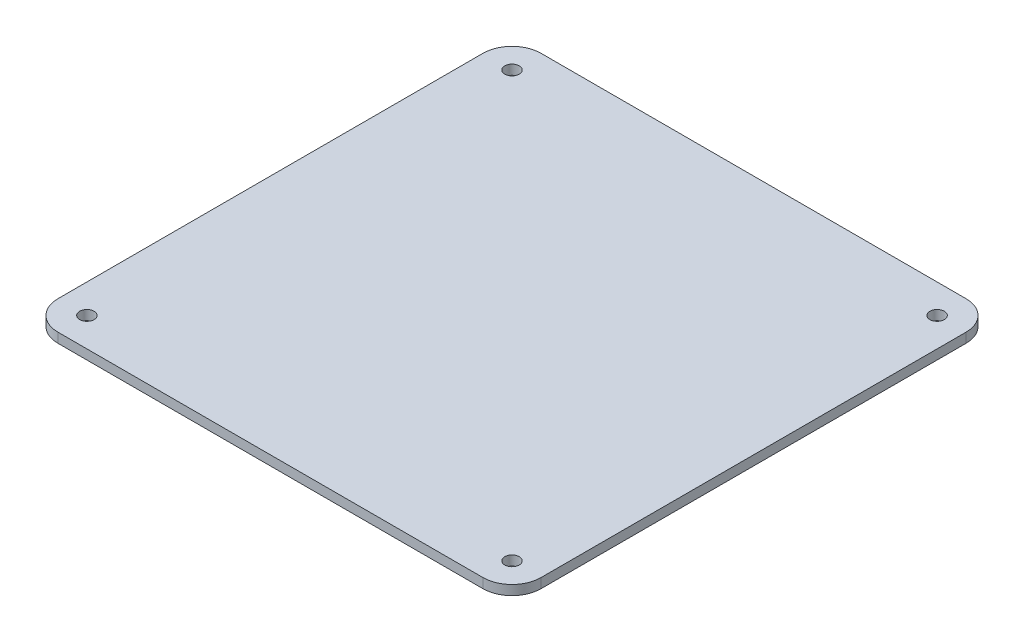
ISO-10303-21;
HEADER;
FILE_DESCRIPTION(('STEP AP214'),'2;1');
FILE_NAME('part.step','',(''),(''),'','','');
FILE_SCHEMA(('AUTOMOTIVE_DESIGN { 1 0 10303 214 1 1 1 1 }'));
ENDSEC;
DATA;
#1=APPLICATION_CONTEXT('core data for automotive mechanical design processes');
#2=APPLICATION_PROTOCOL_DEFINITION('international standard','automotive_design',2000,#1);
#3=PRODUCT_CONTEXT('',#1,'mechanical');
#4=PRODUCT('Part','Part','',(#3));
#5=PRODUCT_RELATED_PRODUCT_CATEGORY('part','',(#4));
#6=PRODUCT_DEFINITION_FORMATION('','',#4);
#7=PRODUCT_DEFINITION_CONTEXT('part definition',#1,'design');
#8=PRODUCT_DEFINITION('design','',#6,#7);
#9=PRODUCT_DEFINITION_SHAPE('','',#8);
#10=(LENGTH_UNIT() NAMED_UNIT(*) SI_UNIT(.MILLI.,.METRE.));
#11=(NAMED_UNIT(*) PLANE_ANGLE_UNIT() SI_UNIT($,.RADIAN.));
#12=(NAMED_UNIT(*) SI_UNIT($,.STERADIAN.) SOLID_ANGLE_UNIT());
#13=UNCERTAINTY_MEASURE_WITH_UNIT(LENGTH_MEASURE(1.E-05),#10,'distance_accuracy_value','');
#14=(GEOMETRIC_REPRESENTATION_CONTEXT(3) GLOBAL_UNCERTAINTY_ASSIGNED_CONTEXT((#13)) GLOBAL_UNIT_ASSIGNED_CONTEXT((#10,
#11,#12)) REPRESENTATION_CONTEXT('',''));
#15=CARTESIAN_POINT('',(0.,0.,0.));
#16=DIRECTION('',(0.,0.,1.));
#17=DIRECTION('',(1.,0.,0.));
#18=AXIS2_PLACEMENT_3D('',#15,#16,#17);
#19=CARTESIAN_POINT('',(-50.,2.,-50.));
#20=DIRECTION('',(1.,0.,0.));
#21=DIRECTION('',(0.,0.,-1.));
#22=AXIS2_PLACEMENT_3D('',#19,#20,#21);
#23=PLANE('',#22);
#24=DIRECTION('',(0.,0.,1.));
#25=VECTOR('',#24,1.);
#26=CARTESIAN_POINT('',(-50.,0.,-50.));
#27=LINE('',#26,#25);
#28=CARTESIAN_POINT('',(-50.,0.,-44.));
#29=VERTEX_POINT('',#28);
#30=CARTESIAN_POINT('',(-50.,0.,44.));
#31=VERTEX_POINT('',#30);
#32=EDGE_CURVE('E139',#29,#31,#27,.T.);
#33=ORIENTED_EDGE('',*,*,#32,.T.);
#34=DIRECTION('',(0.,-1.,0.));
#35=VECTOR('',#34,1.);
#36=CARTESIAN_POINT('',(-50.,2.,44.));
#37=LINE('',#36,#35);
#38=CARTESIAN_POINT('',(-50.,2.,44.));
#39=VERTEX_POINT('',#38);
#40=EDGE_CURVE('E117',#31,#39,#37,.F.);
#41=ORIENTED_EDGE('',*,*,#40,.T.);
#42=DIRECTION('',(0.,0.,1.));
#43=VECTOR('',#42,1.);
#44=CARTESIAN_POINT('',(-50.,2.,-50.));
#45=LINE('',#44,#43);
#46=CARTESIAN_POINT('',(-50.,2.,-44.));
#47=VERTEX_POINT('',#46);
#48=EDGE_CURVE('E151',#47,#39,#45,.T.);
#49=ORIENTED_EDGE('',*,*,#48,.F.);
#50=DIRECTION('',(0.,-1.,0.));
#51=VECTOR('',#50,1.);
#52=CARTESIAN_POINT('',(-50.,2.,-44.));
#53=LINE('',#52,#51);
#54=EDGE_CURVE('E122',#47,#29,#53,.T.);
#55=ORIENTED_EDGE('',*,*,#54,.T.);
#56=EDGE_LOOP('',(#33,#41,#49,#55));
#57=FACE_BOUND('',#56,.T.);
#58=ADVANCED_FACE('F42',(#57),#23,.F.);
#59=CARTESIAN_POINT('',(50.,2.,50.));
#60=DIRECTION('',(0.,0.,-1.));
#61=DIRECTION('',(-1.,0.,0.));
#62=AXIS2_PLACEMENT_3D('',#59,#60,#61);
#63=PLANE('',#62);
#64=DIRECTION('',(1.,0.,0.));
#65=VECTOR('',#64,1.);
#66=CARTESIAN_POINT('',(50.,2.,50.));
#67=LINE('',#66,#65);
#68=CARTESIAN_POINT('',(-44.,2.,50.));
#69=VERTEX_POINT('',#68);
#70=CARTESIAN_POINT('',(44.,2.,50.));
#71=VERTEX_POINT('',#70);
#72=EDGE_CURVE('E132',#69,#71,#67,.T.);
#73=ORIENTED_EDGE('',*,*,#72,.F.);
#74=DIRECTION('',(0.,-1.,0.));
#75=VECTOR('',#74,1.);
#76=CARTESIAN_POINT('',(-44.,2.,50.));
#77=LINE('',#76,#75);
#78=CARTESIAN_POINT('',(-44.,0.,50.));
#79=VERTEX_POINT('',#78);
#80=EDGE_CURVE('E116',#69,#79,#77,.T.);
#81=ORIENTED_EDGE('',*,*,#80,.T.);
#82=DIRECTION('',(1.,0.,0.));
#83=VECTOR('',#82,1.);
#84=CARTESIAN_POINT('',(50.,0.,50.));
#85=LINE('',#84,#83);
#86=CARTESIAN_POINT('',(44.,0.,50.));
#87=VERTEX_POINT('',#86);
#88=EDGE_CURVE('E129',#79,#87,#85,.T.);
#89=ORIENTED_EDGE('',*,*,#88,.T.);
#90=DIRECTION('',(0.,-1.,0.));
#91=VECTOR('',#90,1.);
#92=CARTESIAN_POINT('',(44.,2.,50.));
#93=LINE('',#92,#91);
#94=EDGE_CURVE('E134',#87,#71,#93,.F.);
#95=ORIENTED_EDGE('',*,*,#94,.T.);
#96=EDGE_LOOP('',(#73,#81,#89,#95));
#97=FACE_BOUND('',#96,.T.);
#98=ADVANCED_FACE('F128',(#97),#63,.F.);
#99=CARTESIAN_POINT('',(50.,2.,-50.));
#100=DIRECTION('',(-1.,0.,0.));
#101=DIRECTION('',(0.,0.,1.));
#102=AXIS2_PLACEMENT_3D('',#99,#100,#101);
#103=PLANE('',#102);
#104=DIRECTION('',(0.,0.,-1.));
#105=VECTOR('',#104,1.);
#106=CARTESIAN_POINT('',(50.,2.,-50.));
#107=LINE('',#106,#105);
#108=CARTESIAN_POINT('',(50.,2.,44.));
#109=VERTEX_POINT('',#108);
#110=CARTESIAN_POINT('',(50.,2.,-44.));
#111=VERTEX_POINT('',#110);
#112=EDGE_CURVE('E180',#109,#111,#107,.T.);
#113=ORIENTED_EDGE('',*,*,#112,.F.);
#114=DIRECTION('',(0.,-1.,0.));
#115=VECTOR('',#114,1.);
#116=CARTESIAN_POINT('',(50.,2.,44.));
#117=LINE('',#116,#115);
#118=CARTESIAN_POINT('',(50.,0.,44.));
#119=VERTEX_POINT('',#118);
#120=EDGE_CURVE('E173',#109,#119,#117,.T.);
#121=ORIENTED_EDGE('',*,*,#120,.T.);
#122=DIRECTION('',(0.,0.,-1.));
#123=VECTOR('',#122,1.);
#124=CARTESIAN_POINT('',(50.,0.,-50.));
#125=LINE('',#124,#123);
#126=CARTESIAN_POINT('',(50.,0.,-44.));
#127=VERTEX_POINT('',#126);
#128=EDGE_CURVE('E138',#119,#127,#125,.T.);
#129=ORIENTED_EDGE('',*,*,#128,.T.);
#130=DIRECTION('',(0.,-1.,0.));
#131=VECTOR('',#130,1.);
#132=CARTESIAN_POINT('',(50.,2.,-44.));
#133=LINE('',#132,#131);
#134=EDGE_CURVE('E171',#127,#111,#133,.F.);
#135=ORIENTED_EDGE('',*,*,#134,.T.);
#136=EDGE_LOOP('',(#113,#121,#129,#135));
#137=FACE_BOUND('',#136,.T.);
#138=ADVANCED_FACE('F211',(#137),#103,.F.);
#139=CARTESIAN_POINT('',(50.,2.,-50.));
#140=DIRECTION('',(0.,0.,1.));
#141=DIRECTION('',(1.,0.,0.));
#142=AXIS2_PLACEMENT_3D('',#139,#140,#141);
#143=PLANE('',#142);
#144=DIRECTION('',(-1.,0.,0.));
#145=VECTOR('',#144,1.);
#146=CARTESIAN_POINT('',(50.,2.,-50.));
#147=LINE('',#146,#145);
#148=CARTESIAN_POINT('',(44.,2.,-50.));
#149=VERTEX_POINT('',#148);
#150=CARTESIAN_POINT('',(-44.,2.,-50.));
#151=VERTEX_POINT('',#150);
#152=EDGE_CURVE('E152',#149,#151,#147,.T.);
#153=ORIENTED_EDGE('',*,*,#152,.F.);
#154=DIRECTION('',(0.,-1.,0.));
#155=VECTOR('',#154,1.);
#156=CARTESIAN_POINT('',(44.,2.,-50.));
#157=LINE('',#156,#155);
#158=CARTESIAN_POINT('',(44.,0.,-50.));
#159=VERTEX_POINT('',#158);
#160=EDGE_CURVE('E11',#149,#159,#157,.T.);
#161=ORIENTED_EDGE('',*,*,#160,.T.);
#162=DIRECTION('',(-1.,0.,0.));
#163=VECTOR('',#162,1.);
#164=CARTESIAN_POINT('',(50.,0.,-50.));
#165=LINE('',#164,#163);
#166=CARTESIAN_POINT('',(-44.,0.,-50.));
#167=VERTEX_POINT('',#166);
#168=EDGE_CURVE('E142',#159,#167,#165,.T.);
#169=ORIENTED_EDGE('',*,*,#168,.T.);
#170=DIRECTION('',(0.,-1.,0.));
#171=VECTOR('',#170,1.);
#172=CARTESIAN_POINT('',(-44.,2.,-50.));
#173=LINE('',#172,#171);
#174=EDGE_CURVE('E50',#167,#151,#173,.F.);
#175=ORIENTED_EDGE('',*,*,#174,.T.);
#176=EDGE_LOOP('',(#153,#161,#169,#175));
#177=FACE_BOUND('',#176,.T.);
#178=ADVANCED_FACE('F201',(#177),#143,.F.);
#179=CARTESIAN_POINT('',(0.,2.,0.));
#180=DIRECTION('',(0.,-1.,0.));
#181=DIRECTION('',(0.,0.,-1.));
#182=AXIS2_PLACEMENT_3D('',#179,#180,#181);
#183=PLANE('',#182);
#184=CARTESIAN_POINT('',(43.9999999999995,2.,44.0000000000005));
#185=DIRECTION('',(0.,1.,0.));
#186=DIRECTION('',(0.,0.,1.));
#187=AXIS2_PLACEMENT_3D('',#184,#185,#186);
#188=CIRCLE('',#187,1.5);
#189=CARTESIAN_POINT('',(43.9999999999995,2.,45.5000000000005));
#190=VERTEX_POINT('',#189);
#191=EDGE_CURVE('E326',#190,#190,#188,.T.);
#192=ORIENTED_EDGE('',*,*,#191,.F.);
#193=EDGE_LOOP('',(#192));
#194=FACE_BOUND('',#193,.T.);
#195=CARTESIAN_POINT('',(44.0000000000003,2.,-43.9999999999997));
#196=DIRECTION('',(0.,1.,0.));
#197=DIRECTION('',(0.,0.,1.));
#198=AXIS2_PLACEMENT_3D('',#195,#196,#197);
#199=CIRCLE('',#198,1.5);
#200=CARTESIAN_POINT('',(44.0000000000003,2.,-42.4999999999997));
#201=VERTEX_POINT('',#200);
#202=EDGE_CURVE('E328',#201,#201,#199,.T.);
#203=ORIENTED_EDGE('',*,*,#202,.F.);
#204=EDGE_LOOP('',(#203));
#205=FACE_BOUND('',#204,.T.);
#206=CARTESIAN_POINT('',(-43.9999999999998,2.,-44.0000000000002));
#207=DIRECTION('',(0.,1.,0.));
#208=DIRECTION('',(0.,0.,1.));
#209=AXIS2_PLACEMENT_3D('',#206,#207,#208);
#210=CIRCLE('',#209,1.5);
#211=CARTESIAN_POINT('',(-43.9999999999998,2.,-42.5000000000002));
#212=VERTEX_POINT('',#211);
#213=EDGE_CURVE('E336',#212,#212,#210,.T.);
#214=ORIENTED_EDGE('',*,*,#213,.F.);
#215=EDGE_LOOP('',(#214));
#216=FACE_BOUND('',#215,.T.);
#217=CARTESIAN_POINT('',(-44.,2.,44.));
#218=DIRECTION('',(0.,1.,0.));
#219=DIRECTION('',(0.,0.,1.));
#220=AXIS2_PLACEMENT_3D('',#217,#218,#219);
#221=CIRCLE('',#220,1.5);
#222=CARTESIAN_POINT('',(-44.,2.,45.5));
#223=VERTEX_POINT('',#222);
#224=EDGE_CURVE('E188',#223,#223,#221,.T.);
#225=ORIENTED_EDGE('',*,*,#224,.F.);
#226=EDGE_LOOP('',(#225));
#227=FACE_BOUND('',#226,.T.);
#228=ORIENTED_EDGE('',*,*,#48,.T.);
#229=CARTESIAN_POINT('',(-44.,2.,44.));
#230=DIRECTION('',(0.,-1.,0.));
#231=DIRECTION('',(0.,0.,-1.));
#232=AXIS2_PLACEMENT_3D('',#229,#230,#231);
#233=CIRCLE('',#232,6.);
#234=EDGE_CURVE('E169',#39,#69,#233,.F.);
#235=ORIENTED_EDGE('',*,*,#234,.T.);
#236=ORIENTED_EDGE('',*,*,#72,.T.);
#237=CARTESIAN_POINT('',(44.,2.,44.));
#238=DIRECTION('',(0.,-1.,0.));
#239=DIRECTION('',(0.,0.,-1.));
#240=AXIS2_PLACEMENT_3D('',#237,#238,#239);
#241=CIRCLE('',#240,6.);
#242=EDGE_CURVE('E167',#71,#109,#241,.F.);
#243=ORIENTED_EDGE('',*,*,#242,.T.);
#244=ORIENTED_EDGE('',*,*,#112,.T.);
#245=CARTESIAN_POINT('',(44.,2.,-44.));
#246=DIRECTION('',(0.,-1.,0.));
#247=DIRECTION('',(0.,0.,-1.));
#248=AXIS2_PLACEMENT_3D('',#245,#246,#247);
#249=CIRCLE('',#248,6.);
#250=EDGE_CURVE('E66',#111,#149,#249,.F.);
#251=ORIENTED_EDGE('',*,*,#250,.T.);
#252=ORIENTED_EDGE('',*,*,#152,.T.);
#253=CARTESIAN_POINT('',(-44.,2.,-44.));
#254=DIRECTION('',(0.,-1.,0.));
#255=DIRECTION('',(0.,0.,-1.));
#256=AXIS2_PLACEMENT_3D('',#253,#254,#255);
#257=CIRCLE('',#256,6.);
#258=EDGE_CURVE('E163',#151,#47,#257,.F.);
#259=ORIENTED_EDGE('',*,*,#258,.T.);
#260=EDGE_LOOP('',(#228,#235,#236,#243,#244,#251,#252,#259));
#261=FACE_BOUND('',#260,.T.);
#262=ADVANCED_FACE('F192',(#194,#205,#216,#227,#261),#183,.F.);
#263=CARTESIAN_POINT('',(0.,0.,0.));
#264=DIRECTION('',(0.,-1.,0.));
#265=DIRECTION('',(0.,0.,-1.));
#266=AXIS2_PLACEMENT_3D('',#263,#264,#265);
#267=PLANE('',#266);
#268=CARTESIAN_POINT('',(43.9999999999995,0.,44.0000000000005));
#269=DIRECTION('',(0.,1.,0.));
#270=DIRECTION('',(0.,0.,1.));
#271=AXIS2_PLACEMENT_3D('',#268,#269,#270);
#272=CIRCLE('',#271,1.5);
#273=CARTESIAN_POINT('',(43.9999999999995,0.,45.5000000000005));
#274=VERTEX_POINT('',#273);
#275=EDGE_CURVE('E323',#274,#274,#272,.T.);
#276=ORIENTED_EDGE('',*,*,#275,.T.);
#277=EDGE_LOOP('',(#276));
#278=FACE_BOUND('',#277,.T.);
#279=CARTESIAN_POINT('',(44.0000000000003,0.,-43.9999999999997));
#280=DIRECTION('',(0.,1.,0.));
#281=DIRECTION('',(0.,0.,1.));
#282=AXIS2_PLACEMENT_3D('',#279,#280,#281);
#283=CIRCLE('',#282,1.5);
#284=CARTESIAN_POINT('',(44.0000000000003,0.,-42.4999999999997));
#285=VERTEX_POINT('',#284);
#286=EDGE_CURVE('E341',#285,#285,#283,.T.);
#287=ORIENTED_EDGE('',*,*,#286,.T.);
#288=EDGE_LOOP('',(#287));
#289=FACE_BOUND('',#288,.T.);
#290=CARTESIAN_POINT('',(-43.9999999999998,0.,-44.0000000000002));
#291=DIRECTION('',(0.,1.,0.));
#292=DIRECTION('',(0.,0.,1.));
#293=AXIS2_PLACEMENT_3D('',#290,#291,#292);
#294=CIRCLE('',#293,1.5);
#295=CARTESIAN_POINT('',(-43.9999999999998,0.,-42.5000000000002));
#296=VERTEX_POINT('',#295);
#297=EDGE_CURVE('E177',#296,#296,#294,.T.);
#298=ORIENTED_EDGE('',*,*,#297,.T.);
#299=EDGE_LOOP('',(#298));
#300=FACE_BOUND('',#299,.T.);
#301=CARTESIAN_POINT('',(-44.,0.,44.));
#302=DIRECTION('',(0.,1.,0.));
#303=DIRECTION('',(0.,0.,1.));
#304=AXIS2_PLACEMENT_3D('',#301,#302,#303);
#305=CIRCLE('',#304,1.5);
#306=CARTESIAN_POINT('',(-44.,0.,45.5));
#307=VERTEX_POINT('',#306);
#308=EDGE_CURVE('E145',#307,#307,#305,.T.);
#309=ORIENTED_EDGE('',*,*,#308,.T.);
#310=EDGE_LOOP('',(#309));
#311=FACE_BOUND('',#310,.T.);
#312=ORIENTED_EDGE('',*,*,#88,.F.);
#313=CARTESIAN_POINT('',(-44.,0.,44.));
#314=DIRECTION('',(0.,-1.,0.));
#315=DIRECTION('',(0.,0.,-1.));
#316=AXIS2_PLACEMENT_3D('',#313,#314,#315);
#317=CIRCLE('',#316,6.);
#318=EDGE_CURVE('E112',#79,#31,#317,.T.);
#319=ORIENTED_EDGE('',*,*,#318,.T.);
#320=ORIENTED_EDGE('',*,*,#32,.F.);
#321=CARTESIAN_POINT('',(-44.,0.,-44.));
#322=DIRECTION('',(0.,-1.,0.));
#323=DIRECTION('',(0.,0.,-1.));
#324=AXIS2_PLACEMENT_3D('',#321,#322,#323);
#325=CIRCLE('',#324,6.);
#326=EDGE_CURVE('E133',#29,#167,#325,.T.);
#327=ORIENTED_EDGE('',*,*,#326,.T.);
#328=ORIENTED_EDGE('',*,*,#168,.F.);
#329=CARTESIAN_POINT('',(44.,0.,-44.));
#330=DIRECTION('',(0.,-1.,0.));
#331=DIRECTION('',(0.,0.,-1.));
#332=AXIS2_PLACEMENT_3D('',#329,#330,#331);
#333=CIRCLE('',#332,6.);
#334=EDGE_CURVE('E156',#159,#127,#333,.T.);
#335=ORIENTED_EDGE('',*,*,#334,.T.);
#336=ORIENTED_EDGE('',*,*,#128,.F.);
#337=CARTESIAN_POINT('',(44.,0.,44.));
#338=DIRECTION('',(0.,-1.,0.));
#339=DIRECTION('',(0.,0.,-1.));
#340=AXIS2_PLACEMENT_3D('',#337,#338,#339);
#341=CIRCLE('',#340,6.);
#342=EDGE_CURVE('E123',#119,#87,#341,.T.);
#343=ORIENTED_EDGE('',*,*,#342,.T.);
#344=EDGE_LOOP('',(#312,#319,#320,#327,#328,#335,#336,#343));
#345=FACE_BOUND('',#344,.T.);
#346=ADVANCED_FACE('F136',(#278,#289,#300,#311,#345),#267,.T.);
#347=CARTESIAN_POINT('',(-44.,2.,44.));
#348=DIRECTION('',(0.,-1.,0.));
#349=DIRECTION('',(0.,0.,-1.));
#350=AXIS2_PLACEMENT_3D('',#347,#348,#349);
#351=CYLINDRICAL_SURFACE('',#350,6.);
#352=ORIENTED_EDGE('',*,*,#234,.F.);
#353=ORIENTED_EDGE('',*,*,#40,.F.);
#354=ORIENTED_EDGE('',*,*,#318,.F.);
#355=ORIENTED_EDGE('',*,*,#80,.F.);
#356=EDGE_LOOP('',(#352,#353,#354,#355));
#357=FACE_BOUND('',#356,.T.);
#358=ADVANCED_FACE('F115',(#357),#351,.T.);
#359=CARTESIAN_POINT('',(44.,2.,44.));
#360=DIRECTION('',(0.,-1.,0.));
#361=DIRECTION('',(0.,0.,-1.));
#362=AXIS2_PLACEMENT_3D('',#359,#360,#361);
#363=CYLINDRICAL_SURFACE('',#362,6.);
#364=ORIENTED_EDGE('',*,*,#242,.F.);
#365=ORIENTED_EDGE('',*,*,#94,.F.);
#366=ORIENTED_EDGE('',*,*,#342,.F.);
#367=ORIENTED_EDGE('',*,*,#120,.F.);
#368=EDGE_LOOP('',(#364,#365,#366,#367));
#369=FACE_BOUND('',#368,.T.);
#370=ADVANCED_FACE('F217',(#369),#363,.T.);
#371=CARTESIAN_POINT('',(44.,2.,-44.));
#372=DIRECTION('',(0.,-1.,0.));
#373=DIRECTION('',(0.,0.,-1.));
#374=AXIS2_PLACEMENT_3D('',#371,#372,#373);
#375=CYLINDRICAL_SURFACE('',#374,6.);
#376=ORIENTED_EDGE('',*,*,#250,.F.);
#377=ORIENTED_EDGE('',*,*,#134,.F.);
#378=ORIENTED_EDGE('',*,*,#334,.F.);
#379=ORIENTED_EDGE('',*,*,#160,.F.);
#380=EDGE_LOOP('',(#376,#377,#378,#379));
#381=FACE_BOUND('',#380,.T.);
#382=ADVANCED_FACE('F199',(#381),#375,.T.);
#383=CARTESIAN_POINT('',(-44.,2.,-44.));
#384=DIRECTION('',(0.,-1.,0.));
#385=DIRECTION('',(0.,0.,-1.));
#386=AXIS2_PLACEMENT_3D('',#383,#384,#385);
#387=CYLINDRICAL_SURFACE('',#386,6.);
#388=ORIENTED_EDGE('',*,*,#258,.F.);
#389=ORIENTED_EDGE('',*,*,#174,.F.);
#390=ORIENTED_EDGE('',*,*,#326,.F.);
#391=ORIENTED_EDGE('',*,*,#54,.F.);
#392=EDGE_LOOP('',(#388,#389,#390,#391));
#393=FACE_BOUND('',#392,.T.);
#394=ADVANCED_FACE('F44',(#393),#387,.T.);
#395=CARTESIAN_POINT('',(-44.,0.,44.));
#396=DIRECTION('',(0.,1.,0.));
#397=DIRECTION('',(0.,0.,1.));
#398=AXIS2_PLACEMENT_3D('',#395,#396,#397);
#399=CYLINDRICAL_SURFACE('',#398,1.5);
#400=ORIENTED_EDGE('',*,*,#308,.F.);
#401=EDGE_LOOP('',(#400));
#402=FACE_BOUND('',#401,.T.);
#403=ORIENTED_EDGE('',*,*,#224,.T.);
#404=EDGE_LOOP('',(#403));
#405=FACE_BOUND('',#404,.T.);
#406=ADVANCED_FACE('F224',(#402,#405),#399,.F.);
#407=CARTESIAN_POINT('',(-43.9999999999998,0.,-44.0000000000002));
#408=DIRECTION('',(0.,1.,0.));
#409=DIRECTION('',(0.,0.,1.));
#410=AXIS2_PLACEMENT_3D('',#407,#408,#409);
#411=CYLINDRICAL_SURFACE('',#410,1.5);
#412=ORIENTED_EDGE('',*,*,#297,.F.);
#413=EDGE_LOOP('',(#412));
#414=FACE_BOUND('',#413,.T.);
#415=ORIENTED_EDGE('',*,*,#213,.T.);
#416=EDGE_LOOP('',(#415));
#417=FACE_BOUND('',#416,.T.);
#418=ADVANCED_FACE('F228',(#414,#417),#411,.F.);
#419=CARTESIAN_POINT('',(44.0000000000003,0.,-43.9999999999997));
#420=DIRECTION('',(0.,1.,0.));
#421=DIRECTION('',(0.,0.,1.));
#422=AXIS2_PLACEMENT_3D('',#419,#420,#421);
#423=CYLINDRICAL_SURFACE('',#422,1.5);
#424=ORIENTED_EDGE('',*,*,#286,.F.);
#425=EDGE_LOOP('',(#424));
#426=FACE_BOUND('',#425,.T.);
#427=ORIENTED_EDGE('',*,*,#202,.T.);
#428=EDGE_LOOP('',(#427));
#429=FACE_BOUND('',#428,.T.);
#430=ADVANCED_FACE('F234',(#426,#429),#423,.F.);
#431=CARTESIAN_POINT('',(43.9999999999995,0.,44.0000000000005));
#432=DIRECTION('',(0.,1.,0.));
#433=DIRECTION('',(0.,0.,1.));
#434=AXIS2_PLACEMENT_3D('',#431,#432,#433);
#435=CYLINDRICAL_SURFACE('',#434,1.5);
#436=ORIENTED_EDGE('',*,*,#275,.F.);
#437=EDGE_LOOP('',(#436));
#438=FACE_BOUND('',#437,.T.);
#439=ORIENTED_EDGE('',*,*,#191,.T.);
#440=EDGE_LOOP('',(#439));
#441=FACE_BOUND('',#440,.T.);
#442=ADVANCED_FACE('F241',(#438,#441),#435,.F.);
#443=CLOSED_SHELL('',(#58,#98,#138,#178,#262,#346,#358,#370,#382,#394,#406,#418,#430,#442));
#444=MANIFOLD_SOLID_BREP('B2',#443);
#445=ADVANCED_BREP_SHAPE_REPRESENTATION('',(#18,#444),#14);
#446=SHAPE_DEFINITION_REPRESENTATION(#9,#445);
ENDSEC;
END-ISO-10303-21;
